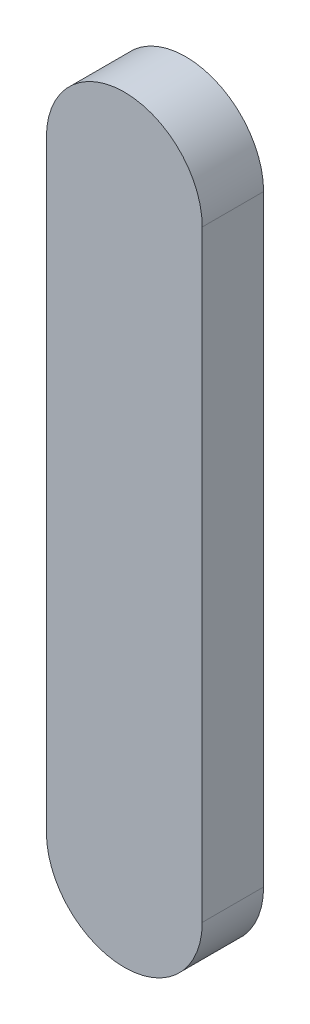
ISO-10303-21;
HEADER;
FILE_DESCRIPTION(('STEP AP214'),'2;1');
FILE_NAME('part.step','',(''),(''),'','','');
FILE_SCHEMA(('AUTOMOTIVE_DESIGN { 1 0 10303 214 1 1 1 1 }'));
ENDSEC;
DATA;
#1=APPLICATION_CONTEXT('core data for automotive mechanical design processes');
#2=APPLICATION_PROTOCOL_DEFINITION('international standard','automotive_design',2000,#1);
#3=PRODUCT_CONTEXT('',#1,'mechanical');
#4=PRODUCT('Part','Part','',(#3));
#5=PRODUCT_RELATED_PRODUCT_CATEGORY('part','',(#4));
#6=PRODUCT_DEFINITION_FORMATION('','',#4);
#7=PRODUCT_DEFINITION_CONTEXT('part definition',#1,'design');
#8=PRODUCT_DEFINITION('design','',#6,#7);
#9=PRODUCT_DEFINITION_SHAPE('','',#8);
#10=(LENGTH_UNIT() NAMED_UNIT(*) SI_UNIT(.MILLI.,.METRE.));
#11=(NAMED_UNIT(*) PLANE_ANGLE_UNIT() SI_UNIT($,.RADIAN.));
#12=(NAMED_UNIT(*) SI_UNIT($,.STERADIAN.) SOLID_ANGLE_UNIT());
#13=UNCERTAINTY_MEASURE_WITH_UNIT(LENGTH_MEASURE(1.E-05),#10,'distance_accuracy_value','');
#14=(GEOMETRIC_REPRESENTATION_CONTEXT(3) GLOBAL_UNCERTAINTY_ASSIGNED_CONTEXT((#13)) GLOBAL_UNIT_ASSIGNED_CONTEXT((#10,
#11,#12)) REPRESENTATION_CONTEXT('',''));
#15=CARTESIAN_POINT('',(0.,0.,0.));
#16=DIRECTION('',(0.,0.,1.));
#17=DIRECTION('',(1.,0.,0.));
#18=AXIS2_PLACEMENT_3D('',#15,#16,#17);
#19=CARTESIAN_POINT('',(131.445,94.361,0.));
#20=DIRECTION('',(-1.,0.,0.));
#21=DIRECTION('',(0.,1.,0.));
#22=AXIS2_PLACEMENT_3D('',#19,#20,#21);
#23=PLANE('',#22);
#24=DIRECTION('',(0.,1.,0.));
#25=VECTOR('',#24,1.);
#26=CARTESIAN_POINT('',(131.445,94.361,0.1999996));
#27=LINE('',#26,#25);
#28=CARTESIAN_POINT('',(131.445,94.361,0.1999996));
#29=VERTEX_POINT('',#28);
#30=CARTESIAN_POINT('',(131.445,96.32401868,0.1999996));
#31=VERTEX_POINT('',#30);
#32=EDGE_CURVE('E11',#29,#31,#27,.T.);
#33=ORIENTED_EDGE('',*,*,#32,.F.);
#34=DIRECTION('',(0.,0.,1.));
#35=VECTOR('',#34,1.);
#36=CARTESIAN_POINT('',(131.445,94.361,0.));
#37=LINE('',#36,#35);
#38=CARTESIAN_POINT('',(131.445,94.361,0.));
#39=VERTEX_POINT('',#38);
#40=EDGE_CURVE('E24',#39,#29,#37,.T.);
#41=ORIENTED_EDGE('',*,*,#40,.F.);
#42=DIRECTION('',(0.,1.,0.));
#43=VECTOR('',#42,1.);
#44=CARTESIAN_POINT('',(131.445,94.361,0.));
#45=LINE('',#44,#43);
#46=CARTESIAN_POINT('',(131.445,96.32401868,0.));
#47=VERTEX_POINT('',#46);
#48=EDGE_CURVE('E75',#39,#47,#45,.T.);
#49=ORIENTED_EDGE('',*,*,#48,.T.);
#50=DIRECTION('',(0.,0.,1.));
#51=VECTOR('',#50,1.);
#52=CARTESIAN_POINT('',(131.445,96.32401868,0.));
#53=LINE('',#52,#51);
#54=EDGE_CURVE('E37',#47,#31,#53,.T.);
#55=ORIENTED_EDGE('',*,*,#54,.T.);
#56=EDGE_LOOP('',(#33,#41,#49,#55));
#57=FACE_BOUND('',#56,.T.);
#58=ADVANCED_FACE('F17',(#57),#23,.F.);
#59=CARTESIAN_POINT('',(131.191,96.32401868,0.));
#60=DIRECTION('',(0.,0.,-1.));
#61=DIRECTION('',(1.,0.,0.));
#62=AXIS2_PLACEMENT_3D('',#59,#60,#61);
#63=CYLINDRICAL_SURFACE('',#62,0.253999999999986);
#64=CARTESIAN_POINT('',(131.191,96.32401868,0.1999996));
#65=DIRECTION('',(0.,0.,1.));
#66=DIRECTION('',(1.,0.,0.));
#67=AXIS2_PLACEMENT_3D('',#64,#65,#66);
#68=CIRCLE('',#67,0.253999999999986);
#69=CARTESIAN_POINT('',(130.937,96.32401868,0.1999996));
#70=VERTEX_POINT('',#69);
#71=EDGE_CURVE('E83',#31,#70,#68,.T.);
#72=ORIENTED_EDGE('',*,*,#71,.F.);
#73=ORIENTED_EDGE('',*,*,#54,.F.);
#74=CARTESIAN_POINT('',(131.191,96.32401868,0.));
#75=DIRECTION('',(0.,0.,1.));
#76=DIRECTION('',(1.,0.,0.));
#77=AXIS2_PLACEMENT_3D('',#74,#75,#76);
#78=CIRCLE('',#77,0.253999999999986);
#79=CARTESIAN_POINT('',(130.937,96.32401868,0.));
#80=VERTEX_POINT('',#79);
#81=EDGE_CURVE('E81',#47,#80,#78,.T.);
#82=ORIENTED_EDGE('',*,*,#81,.T.);
#83=DIRECTION('',(0.,0.,1.));
#84=VECTOR('',#83,1.);
#85=CARTESIAN_POINT('',(130.937,96.32401868,0.));
#86=LINE('',#85,#84);
#87=EDGE_CURVE('E67',#80,#70,#86,.T.);
#88=ORIENTED_EDGE('',*,*,#87,.T.);
#89=EDGE_LOOP('',(#72,#73,#82,#88));
#90=FACE_BOUND('',#89,.T.);
#91=ADVANCED_FACE('F89',(#90),#63,.T.);
#92=CARTESIAN_POINT('',(130.937,96.32401868,0.));
#93=DIRECTION('',(1.,0.,0.));
#94=DIRECTION('',(0.,-1.,0.));
#95=AXIS2_PLACEMENT_3D('',#92,#93,#94);
#96=PLANE('',#95);
#97=DIRECTION('',(0.,-1.,0.));
#98=VECTOR('',#97,1.);
#99=CARTESIAN_POINT('',(130.937,96.32401868,0.1999996));
#100=LINE('',#99,#98);
#101=CARTESIAN_POINT('',(130.937,94.361,0.1999996));
#102=VERTEX_POINT('',#101);
#103=EDGE_CURVE('E71',#70,#102,#100,.T.);
#104=ORIENTED_EDGE('',*,*,#103,.F.);
#105=ORIENTED_EDGE('',*,*,#87,.F.);
#106=DIRECTION('',(0.,-1.,0.));
#107=VECTOR('',#106,1.);
#108=CARTESIAN_POINT('',(130.937,96.32401868,0.));
#109=LINE('',#108,#107);
#110=CARTESIAN_POINT('',(130.937,94.361,0.));
#111=VERTEX_POINT('',#110);
#112=EDGE_CURVE('E63',#80,#111,#109,.T.);
#113=ORIENTED_EDGE('',*,*,#112,.T.);
#114=DIRECTION('',(0.,0.,1.));
#115=VECTOR('',#114,1.);
#116=CARTESIAN_POINT('',(130.937,94.361,0.));
#117=LINE('',#116,#115);
#118=EDGE_CURVE('E53',#111,#102,#117,.T.);
#119=ORIENTED_EDGE('',*,*,#118,.T.);
#120=EDGE_LOOP('',(#104,#105,#113,#119));
#121=FACE_BOUND('',#120,.T.);
#122=ADVANCED_FACE('F66',(#121),#96,.F.);
#123=CARTESIAN_POINT('',(131.191,94.361,0.));
#124=DIRECTION('',(0.,0.,-1.));
#125=DIRECTION('',(-1.,0.,0.));
#126=AXIS2_PLACEMENT_3D('',#123,#124,#125);
#127=CYLINDRICAL_SURFACE('',#126,0.253999999999991);
#128=CARTESIAN_POINT('',(131.191,94.361,0.1999996));
#129=DIRECTION('',(0.,0.,1.));
#130=DIRECTION('',(-1.,0.,0.));
#131=AXIS2_PLACEMENT_3D('',#128,#129,#130);
#132=CIRCLE('',#131,0.253999999999991);
#133=EDGE_CURVE('E59',#102,#29,#132,.T.);
#134=ORIENTED_EDGE('',*,*,#133,.F.);
#135=ORIENTED_EDGE('',*,*,#118,.F.);
#136=CARTESIAN_POINT('',(131.191,94.361,0.));
#137=DIRECTION('',(0.,0.,1.));
#138=DIRECTION('',(-1.,0.,0.));
#139=AXIS2_PLACEMENT_3D('',#136,#137,#138);
#140=CIRCLE('',#139,0.253999999999991);
#141=EDGE_CURVE('E57',#111,#39,#140,.T.);
#142=ORIENTED_EDGE('',*,*,#141,.T.);
#143=ORIENTED_EDGE('',*,*,#40,.T.);
#144=EDGE_LOOP('',(#134,#135,#142,#143));
#145=FACE_BOUND('',#144,.T.);
#146=ADVANCED_FACE('F55',(#145),#127,.T.);
#147=CARTESIAN_POINT('',(131.445,94.361,0.));
#148=DIRECTION('',(0.,0.,-1.));
#149=DIRECTION('',(-1.,0.,0.));
#150=AXIS2_PLACEMENT_3D('',#147,#148,#149);
#151=PLANE('',#150);
#152=ORIENTED_EDGE('',*,*,#141,.F.);
#153=ORIENTED_EDGE('',*,*,#112,.F.);
#154=ORIENTED_EDGE('',*,*,#81,.F.);
#155=ORIENTED_EDGE('',*,*,#48,.F.);
#156=EDGE_LOOP('',(#152,#153,#154,#155));
#157=FACE_BOUND('',#156,.T.);
#158=ADVANCED_FACE('F74',(#157),#151,.T.);
#159=CARTESIAN_POINT('',(131.445,94.361,0.1999996));
#160=DIRECTION('',(0.,0.,-1.));
#161=DIRECTION('',(-1.,0.,0.));
#162=AXIS2_PLACEMENT_3D('',#159,#160,#161);
#163=PLANE('',#162);
#164=ORIENTED_EDGE('',*,*,#32,.T.);
#165=ORIENTED_EDGE('',*,*,#71,.T.);
#166=ORIENTED_EDGE('',*,*,#103,.T.);
#167=ORIENTED_EDGE('',*,*,#133,.T.);
#168=EDGE_LOOP('',(#164,#165,#166,#167));
#169=FACE_BOUND('',#168,.T.);
#170=ADVANCED_FACE('F91',(#169),#163,.F.);
#171=CLOSED_SHELL('',(#58,#91,#122,#146,#158,#170));
#172=MANIFOLD_SOLID_BREP('B1',#171);
#173=ADVANCED_BREP_SHAPE_REPRESENTATION('',(#18,#172),#14);
#174=SHAPE_DEFINITION_REPRESENTATION(#9,#173);
ENDSEC;
END-ISO-10303-21;
